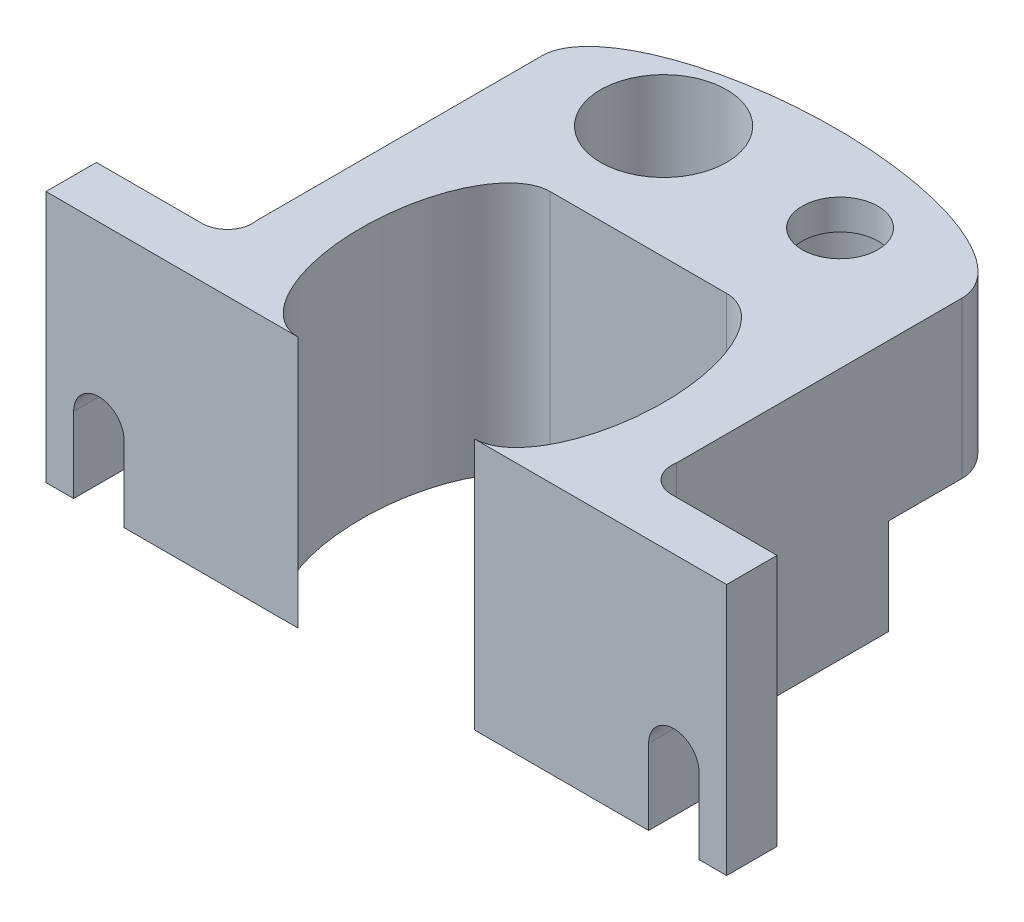
ISO-10303-21;
HEADER;
FILE_DESCRIPTION(('STEP AP214'),'2;1');
FILE_NAME('part.step','',(''),(''),'','','');
FILE_SCHEMA(('AUTOMOTIVE_DESIGN { 1 0 10303 214 1 1 1 1 }'));
ENDSEC;
DATA;
#1=APPLICATION_CONTEXT('core data for automotive mechanical design processes');
#2=APPLICATION_PROTOCOL_DEFINITION('international standard','automotive_design',2000,#1);
#3=PRODUCT_CONTEXT('',#1,'mechanical');
#4=PRODUCT('Part','Part','',(#3));
#5=PRODUCT_RELATED_PRODUCT_CATEGORY('part','',(#4));
#6=PRODUCT_DEFINITION_FORMATION('','',#4);
#7=PRODUCT_DEFINITION_CONTEXT('part definition',#1,'design');
#8=PRODUCT_DEFINITION('design','',#6,#7);
#9=PRODUCT_DEFINITION_SHAPE('','',#8);
#10=(LENGTH_UNIT() NAMED_UNIT(*) SI_UNIT(.MILLI.,.METRE.));
#11=(NAMED_UNIT(*) PLANE_ANGLE_UNIT() SI_UNIT($,.RADIAN.));
#12=(NAMED_UNIT(*) SI_UNIT($,.STERADIAN.) SOLID_ANGLE_UNIT());
#13=UNCERTAINTY_MEASURE_WITH_UNIT(LENGTH_MEASURE(1.E-05),#10,'distance_accuracy_value','');
#14=(GEOMETRIC_REPRESENTATION_CONTEXT(3) GLOBAL_UNCERTAINTY_ASSIGNED_CONTEXT((#13)) GLOBAL_UNIT_ASSIGNED_CONTEXT((#10,
#11,#12)) REPRESENTATION_CONTEXT('',''));
#15=CARTESIAN_POINT('',(0.,0.,0.));
#16=DIRECTION('',(0.,0.,1.));
#17=DIRECTION('',(1.,0.,0.));
#18=AXIS2_PLACEMENT_3D('',#15,#16,#17);
#19=CARTESIAN_POINT('',(0.,0.,0.));
#20=DIRECTION('',(0.,1.,0.));
#21=DIRECTION('',(0.,0.,1.));
#22=AXIS2_PLACEMENT_3D('',#19,#20,#21);
#23=PLANE('',#22);
#24=DIRECTION('',(-1.,0.,0.));
#25=VECTOR('',#24,1.);
#26=CARTESIAN_POINT('',(0.,0.,3.));
#27=LINE('',#26,#25);
#28=CARTESIAN_POINT('',(10.4056244535334,0.,3.));
#29=VERTEX_POINT('',#28);
#30=CARTESIAN_POINT('',(9.31124890706684,0.,3.));
#31=VERTEX_POINT('',#30);
#32=EDGE_CURVE('E317',#29,#31,#27,.T.);
#33=ORIENTED_EDGE('',*,*,#32,.F.);
#34=DIRECTION('',(0.,0.,-1.));
#35=VECTOR('',#34,1.);
#36=CARTESIAN_POINT('',(10.4056244535334,0.,13.));
#37=LINE('',#36,#35);
#38=CARTESIAN_POINT('',(10.4056244535334,0.,5.));
#39=VERTEX_POINT('',#38);
#40=EDGE_CURVE('E441',#39,#29,#37,.T.);
#41=ORIENTED_EDGE('',*,*,#40,.F.);
#42=DIRECTION('',(1.,0.,0.));
#43=VECTOR('',#42,1.);
#44=CARTESIAN_POINT('',(0.,0.,5.));
#45=LINE('',#44,#43);
#46=CARTESIAN_POINT('',(3.5,0.,5.));
#47=VERTEX_POINT('',#46);
#48=EDGE_CURVE('E312',#47,#39,#45,.T.);
#49=ORIENTED_EDGE('',*,*,#48,.F.);
#50=CARTESIAN_POINT('',(3.5,0.,0.));
#51=DIRECTION('',(0.,1.,0.));
#52=DIRECTION('',(0.,0.,-1.));
#53=AXIS2_PLACEMENT_3D('',#50,#51,#52);
#54=ELLIPSE('',#53,5.,2.4986948245632);
#55=CARTESIAN_POINT('',(3.5,0.,-5.));
#56=VERTEX_POINT('',#55);
#57=EDGE_CURVE('E307',#47,#56,#54,.T.);
#58=ORIENTED_EDGE('',*,*,#57,.T.);
#59=DIRECTION('',(1.,0.,0.));
#60=VECTOR('',#59,1.);
#61=CARTESIAN_POINT('',(0.,0.,-5.));
#62=LINE('',#61,#60);
#63=CARTESIAN_POINT('',(-3.5,0.,-5.));
#64=VERTEX_POINT('',#63);
#65=EDGE_CURVE('E348',#64,#56,#62,.T.);
#66=ORIENTED_EDGE('',*,*,#65,.F.);
#67=CARTESIAN_POINT('',(-3.5,0.,0.));
#68=DIRECTION('',(0.,1.,0.));
#69=DIRECTION('',(0.,0.,-1.));
#70=AXIS2_PLACEMENT_3D('',#67,#68,#69);
#71=ELLIPSE('',#70,5.,2.49975501213094);
#72=CARTESIAN_POINT('',(-3.5,0.,5.));
#73=VERTEX_POINT('',#72);
#74=EDGE_CURVE('E345',#64,#73,#71,.T.);
#75=ORIENTED_EDGE('',*,*,#74,.T.);
#76=DIRECTION('',(-1.,0.,0.));
#77=VECTOR('',#76,1.);
#78=CARTESIAN_POINT('',(0.,0.,5.));
#79=LINE('',#78,#77);
#80=CARTESIAN_POINT('',(-10.4039310211756,0.,5.));
#81=VERTEX_POINT('',#80);
#82=EDGE_CURVE('E342',#73,#81,#79,.T.);
#83=ORIENTED_EDGE('',*,*,#82,.T.);
#84=DIRECTION('',(0.,0.,-1.));
#85=VECTOR('',#84,1.);
#86=CARTESIAN_POINT('',(-10.4039310211756,0.,0.));
#87=LINE('',#86,#85);
#88=CARTESIAN_POINT('',(-10.4039310211756,0.,3.));
#89=VERTEX_POINT('',#88);
#90=EDGE_CURVE('E44',#81,#89,#87,.T.);
#91=ORIENTED_EDGE('',*,*,#90,.T.);
#92=DIRECTION('',(1.,0.,0.));
#93=VECTOR('',#92,1.);
#94=CARTESIAN_POINT('',(0.,0.,3.));
#95=LINE('',#94,#93);
#96=CARTESIAN_POINT('',(-9.30786204235129,0.,3.));
#97=VERTEX_POINT('',#96);
#98=EDGE_CURVE('E334',#89,#97,#95,.T.);
#99=ORIENTED_EDGE('',*,*,#98,.T.);
#100=CARTESIAN_POINT('',(-9.30786204235129,0.,2.00000000000001));
#101=DIRECTION('',(0.,1.,0.));
#102=DIRECTION('',(0.,0.,1.));
#103=AXIS2_PLACEMENT_3D('',#100,#101,#102);
#104=CIRCLE('',#103,0.999999999999997);
#105=CARTESIAN_POINT('',(-8.32568240430338,0.,1.8120554374182));
#106=VERTEX_POINT('',#105);
#107=EDGE_CURVE('E331',#97,#106,#104,.T.);
#108=ORIENTED_EDGE('',*,*,#107,.T.);
#109=DIRECTION('',(0.,0.,-1.));
#110=VECTOR('',#109,1.);
#111=CARTESIAN_POINT('',(-8.32568240430338,0.,0.));
#112=LINE('',#111,#110);
#113=CARTESIAN_POINT('',(-8.32568240430338,0.,-6.6));
#114=VERTEX_POINT('',#113);
#115=EDGE_CURVE('E328',#106,#114,#112,.T.);
#116=ORIENTED_EDGE('',*,*,#115,.T.);
#117=DIRECTION('',(1.,0.,0.));
#118=VECTOR('',#117,1.);
#119=CARTESIAN_POINT('',(0.,0.,-6.6));
#120=LINE('',#119,#118);
#121=CARTESIAN_POINT('',(8.32909126483986,0.,-6.6));
#122=VERTEX_POINT('',#121);
#123=EDGE_CURVE('E325',#114,#122,#120,.T.);
#124=ORIENTED_EDGE('',*,*,#123,.T.);
#125=DIRECTION('',(0.,0.,-1.));
#126=VECTOR('',#125,1.);
#127=CARTESIAN_POINT('',(8.32909126483986,0.,0.));
#128=LINE('',#127,#126);
#129=CARTESIAN_POINT('',(8.32909126483986,0.,1.81194052585648));
#130=VERTEX_POINT('',#129);
#131=EDGE_CURVE('E323',#130,#122,#128,.T.);
#132=ORIENTED_EDGE('',*,*,#131,.F.);
#133=CARTESIAN_POINT('',(9.31124890706684,0.,2.));
#134=DIRECTION('',(0.,1.,0.));
#135=DIRECTION('',(0.,0.,1.));
#136=AXIS2_PLACEMENT_3D('',#133,#134,#135);
#137=CIRCLE('',#136,0.999999999999998);
#138=EDGE_CURVE('E321',#31,#130,#137,.F.);
#139=ORIENTED_EDGE('',*,*,#138,.F.);
#140=EDGE_LOOP('',(#33,#41,#49,#58,#66,#75,#83,#91,#99,#108,#116,#124,#132,#139));
#141=FACE_BOUND('',#140,.T.);
#142=ADVANCED_FACE('F35',(#141),#23,.F.);
#143=CARTESIAN_POINT('',(12.4056244535334,0.,5.));
#144=VERTEX_POINT('',#143);
#145=CARTESIAN_POINT('',(13.5,0.,5.));
#146=VERTEX_POINT('',#145);
#147=EDGE_CURVE('E310',#144,#146,#45,.T.);
#148=ORIENTED_EDGE('',*,*,#147,.F.);
#149=DIRECTION('',(0.,0.,-1.));
#150=VECTOR('',#149,1.);
#151=CARTESIAN_POINT('',(12.4056244535334,0.,13.));
#152=LINE('',#151,#150);
#153=CARTESIAN_POINT('',(12.4056244535334,0.,3.));
#154=VERTEX_POINT('',#153);
#155=EDGE_CURVE('E433',#144,#154,#152,.T.);
#156=ORIENTED_EDGE('',*,*,#155,.T.);
#157=CARTESIAN_POINT('',(13.5,0.,3.));
#158=VERTEX_POINT('',#157);
#159=EDGE_CURVE('E318',#158,#154,#27,.T.);
#160=ORIENTED_EDGE('',*,*,#159,.F.);
#161=DIRECTION('',(0.,0.,-1.));
#162=VECTOR('',#161,1.);
#163=CARTESIAN_POINT('',(13.5,0.,0.));
#164=LINE('',#163,#162);
#165=EDGE_CURVE('E315',#146,#158,#164,.T.);
#166=ORIENTED_EDGE('',*,*,#165,.F.);
#167=EDGE_LOOP('',(#148,#156,#160,#166));
#168=FACE_BOUND('',#167,.T.);
#169=ADVANCED_FACE('F286',(#168),#23,.F.);
#170=CARTESIAN_POINT('',(3.5,10.,0.));
#171=DIRECTION('',(0.,1.,0.));
#172=DIRECTION('',(0.,0.,-1.));
#173=AXIS2_PLACEMENT_3D('',#170,#171,#172);
#174=ELLIPSE('',#173,5.,2.4986948245632);
#175=DIRECTION('',(0.,-1.,0.));
#176=VECTOR('',#175,1.);
#177=SURFACE_OF_LINEAR_EXTRUSION('',#174,#176);
#178=ORIENTED_EDGE('',*,*,#57,.F.);
#179=DIRECTION('',(0.,-1.,0.));
#180=VECTOR('',#179,1.);
#181=CARTESIAN_POINT('',(3.5,10.,5.));
#182=LINE('',#181,#180);
#183=CARTESIAN_POINT('',(3.5,10.,5.));
#184=VERTEX_POINT('',#183);
#185=EDGE_CURVE('E381',#184,#47,#182,.T.);
#186=ORIENTED_EDGE('',*,*,#185,.F.);
#187=CARTESIAN_POINT('',(3.5,10.,-5.));
#188=VERTEX_POINT('',#187);
#189=EDGE_CURVE('E351',#184,#188,#174,.T.);
#190=ORIENTED_EDGE('',*,*,#189,.T.);
#191=DIRECTION('',(0.,-1.,0.));
#192=VECTOR('',#191,1.);
#193=CARTESIAN_POINT('',(3.5,10.,-5.));
#194=LINE('',#193,#192);
#195=EDGE_CURVE('E306',#188,#56,#194,.T.);
#196=ORIENTED_EDGE('',*,*,#195,.T.);
#197=EDGE_LOOP('',(#178,#186,#190,#196));
#198=FACE_BOUND('',#197,.T.);
#199=ADVANCED_FACE('F37',(#198),#177,.T.);
#200=CARTESIAN_POINT('',(0.,10.,5.));
#201=DIRECTION('',(0.,0.,-1.));
#202=DIRECTION('',(-1.,0.,0.));
#203=AXIS2_PLACEMENT_3D('',#200,#201,#202);
#204=PLANE('',#203);
#205=ORIENTED_EDGE('',*,*,#48,.T.);
#206=DIRECTION('',(0.,1.,0.));
#207=VECTOR('',#206,1.);
#208=CARTESIAN_POINT('',(10.4056244535334,10.,5.));
#209=LINE('',#208,#207);
#210=CARTESIAN_POINT('',(10.4056244535334,3.,5.));
#211=VERTEX_POINT('',#210);
#212=EDGE_CURVE('E447',#39,#211,#209,.T.);
#213=ORIENTED_EDGE('',*,*,#212,.T.);
#214=CARTESIAN_POINT('',(11.4056244535334,3.,5.));
#215=DIRECTION('',(0.,0.,-1.));
#216=DIRECTION('',(-1.,0.,0.));
#217=AXIS2_PLACEMENT_3D('',#214,#215,#216);
#218=CIRCLE('',#217,1.);
#219=CARTESIAN_POINT('',(12.4056244535334,3.,5.));
#220=VERTEX_POINT('',#219);
#221=EDGE_CURVE('E450',#211,#220,#218,.T.);
#222=ORIENTED_EDGE('',*,*,#221,.T.);
#223=DIRECTION('',(0.,-1.,0.));
#224=VECTOR('',#223,1.);
#225=CARTESIAN_POINT('',(12.4056244535334,10.,5.));
#226=LINE('',#225,#224);
#227=EDGE_CURVE('E440',#220,#144,#226,.T.);
#228=ORIENTED_EDGE('',*,*,#227,.T.);
#229=ORIENTED_EDGE('',*,*,#147,.T.);
#230=DIRECTION('',(0.,-1.,0.));
#231=VECTOR('',#230,1.);
#232=CARTESIAN_POINT('',(13.5,10.,5.));
#233=LINE('',#232,#231);
#234=CARTESIAN_POINT('',(13.5,10.,5.));
#235=VERTEX_POINT('',#234);
#236=EDGE_CURVE('E378',#235,#146,#233,.T.);
#237=ORIENTED_EDGE('',*,*,#236,.F.);
#238=DIRECTION('',(1.,0.,0.));
#239=VECTOR('',#238,1.);
#240=CARTESIAN_POINT('',(0.,10.,5.));
#241=LINE('',#240,#239);
#242=EDGE_CURVE('E469',#184,#235,#241,.T.);
#243=ORIENTED_EDGE('',*,*,#242,.F.);
#244=ORIENTED_EDGE('',*,*,#185,.T.);
#245=EDGE_LOOP('',(#205,#213,#222,#228,#229,#237,#243,#244));
#246=FACE_BOUND('',#245,.T.);
#247=ADVANCED_FACE('F503',(#246),#204,.F.);
#248=CARTESIAN_POINT('',(13.5,10.,0.));
#249=DIRECTION('',(-1.,0.,0.));
#250=DIRECTION('',(0.,0.,1.));
#251=AXIS2_PLACEMENT_3D('',#248,#249,#250);
#252=PLANE('',#251);
#253=ORIENTED_EDGE('',*,*,#165,.T.);
#254=DIRECTION('',(0.,-1.,0.));
#255=VECTOR('',#254,1.);
#256=CARTESIAN_POINT('',(13.5,10.,3.));
#257=LINE('',#256,#255);
#258=CARTESIAN_POINT('',(13.5,10.,3.));
#259=VERTEX_POINT('',#258);
#260=EDGE_CURVE('E375',#259,#158,#257,.T.);
#261=ORIENTED_EDGE('',*,*,#260,.F.);
#262=DIRECTION('',(0.,0.,-1.));
#263=VECTOR('',#262,1.);
#264=CARTESIAN_POINT('',(13.5,10.,0.));
#265=LINE('',#264,#263);
#266=EDGE_CURVE('E471',#235,#259,#265,.T.);
#267=ORIENTED_EDGE('',*,*,#266,.F.);
#268=ORIENTED_EDGE('',*,*,#236,.T.);
#269=EDGE_LOOP('',(#253,#261,#267,#268));
#270=FACE_BOUND('',#269,.T.);
#271=ADVANCED_FACE('F509',(#270),#252,.F.);
#272=CARTESIAN_POINT('',(0.,10.,3.));
#273=DIRECTION('',(0.,0.,1.));
#274=DIRECTION('',(1.,0.,0.));
#275=AXIS2_PLACEMENT_3D('',#272,#273,#274);
#276=PLANE('',#275);
#277=CARTESIAN_POINT('',(11.4056244535334,3.,3.));
#278=DIRECTION('',(0.,0.,-1.));
#279=DIRECTION('',(-1.,0.,0.));
#280=AXIS2_PLACEMENT_3D('',#277,#278,#279);
#281=CIRCLE('',#280,1.);
#282=CARTESIAN_POINT('',(10.4056244535334,3.,3.));
#283=VERTEX_POINT('',#282);
#284=CARTESIAN_POINT('',(12.4056244535334,3.,3.));
#285=VERTEX_POINT('',#284);
#286=EDGE_CURVE('E427',#283,#285,#281,.T.);
#287=ORIENTED_EDGE('',*,*,#286,.F.);
#288=DIRECTION('',(0.,1.,0.));
#289=VECTOR('',#288,1.);
#290=CARTESIAN_POINT('',(10.4056244535334,3.,3.));
#291=LINE('',#290,#289);
#292=EDGE_CURVE('E425',#29,#283,#291,.T.);
#293=ORIENTED_EDGE('',*,*,#292,.F.);
#294=ORIENTED_EDGE('',*,*,#32,.T.);
#295=DIRECTION('',(0.,-1.,0.));
#296=VECTOR('',#295,1.);
#297=CARTESIAN_POINT('',(9.31124890706684,10.,3.));
#298=LINE('',#297,#296);
#299=CARTESIAN_POINT('',(9.31124890706684,10.,3.));
#300=VERTEX_POINT('',#299);
#301=EDGE_CURVE('E372',#300,#31,#298,.T.);
#302=ORIENTED_EDGE('',*,*,#301,.F.);
#303=DIRECTION('',(-1.,0.,0.));
#304=VECTOR('',#303,1.);
#305=CARTESIAN_POINT('',(0.,10.,3.));
#306=LINE('',#305,#304);
#307=EDGE_CURVE('E422',#259,#300,#306,.T.);
#308=ORIENTED_EDGE('',*,*,#307,.F.);
#309=ORIENTED_EDGE('',*,*,#260,.T.);
#310=ORIENTED_EDGE('',*,*,#159,.T.);
#311=DIRECTION('',(0.,-1.,0.));
#312=VECTOR('',#311,1.);
#313=CARTESIAN_POINT('',(12.4056244535334,3.,3.));
#314=LINE('',#313,#312);
#315=EDGE_CURVE('E430',#285,#154,#314,.T.);
#316=ORIENTED_EDGE('',*,*,#315,.F.);
#317=EDGE_LOOP('',(#287,#293,#294,#302,#308,#309,#310,#316));
#318=FACE_BOUND('',#317,.T.);
#319=ADVANCED_FACE('F421',(#318),#276,.F.);
#320=CARTESIAN_POINT('',(9.31124890706684,10.,2.));
#321=DIRECTION('',(0.,-1.,0.));
#322=DIRECTION('',(0.,0.,-1.));
#323=AXIS2_PLACEMENT_3D('',#320,#321,#322);
#324=CYLINDRICAL_SURFACE('',#323,0.999999999999998);
#325=ORIENTED_EDGE('',*,*,#138,.T.);
#326=DIRECTION('',(0.,-1.,0.));
#327=VECTOR('',#326,1.);
#328=CARTESIAN_POINT('',(8.32909126483986,10.,1.81194052585648));
#329=LINE('',#328,#327);
#330=CARTESIAN_POINT('',(8.32909126483986,10.,1.81194052585648));
#331=VERTEX_POINT('',#330);
#332=EDGE_CURVE('E369',#331,#130,#329,.T.);
#333=ORIENTED_EDGE('',*,*,#332,.F.);
#334=CARTESIAN_POINT('',(9.31124890706684,10.,2.));
#335=DIRECTION('',(0.,1.,0.));
#336=DIRECTION('',(0.,0.,1.));
#337=AXIS2_PLACEMENT_3D('',#334,#335,#336);
#338=CIRCLE('',#337,0.999999999999998);
#339=EDGE_CURVE('E417',#300,#331,#338,.F.);
#340=ORIENTED_EDGE('',*,*,#339,.F.);
#341=ORIENTED_EDGE('',*,*,#301,.T.);
#342=EDGE_LOOP('',(#325,#333,#340,#341));
#343=FACE_BOUND('',#342,.T.);
#344=ADVANCED_FACE('F414',(#343),#324,.F.);
#345=CARTESIAN_POINT('',(8.32909126483986,10.,0.));
#346=DIRECTION('',(-1.,0.,0.));
#347=DIRECTION('',(0.,0.,1.));
#348=AXIS2_PLACEMENT_3D('',#345,#346,#347);
#349=PLANE('',#348);
#350=DIRECTION('',(0.,-1.,0.));
#351=VECTOR('',#350,1.);
#352=CARTESIAN_POINT('',(8.32909126483986,10.,-6.6));
#353=LINE('',#352,#351);
#354=CARTESIAN_POINT('',(8.32909126483986,3.8,-6.6));
#355=VERTEX_POINT('',#354);
#356=EDGE_CURVE('E212',#355,#122,#353,.T.);
#357=ORIENTED_EDGE('',*,*,#356,.F.);
#358=DIRECTION('',(0.,0.,1.));
#359=VECTOR('',#358,1.);
#360=CARTESIAN_POINT('',(8.32909126483986,3.8,0.));
#361=LINE('',#360,#359);
#362=CARTESIAN_POINT('',(8.32909126483986,3.8,-9.4986379308905));
#363=VERTEX_POINT('',#362);
#364=EDGE_CURVE('E209',#363,#355,#361,.T.);
#365=ORIENTED_EDGE('',*,*,#364,.F.);
#366=DIRECTION('',(0.,1.,0.));
#367=VECTOR('',#366,1.);
#368=CARTESIAN_POINT('',(8.32909126483986,8.8,-9.4986379308905));
#369=LINE('',#368,#367);
#370=CARTESIAN_POINT('',(8.32909126483986,10.,-9.4986379308905));
#371=VERTEX_POINT('',#370);
#372=EDGE_CURVE('E195',#363,#371,#369,.T.);
#373=ORIENTED_EDGE('',*,*,#372,.T.);
#374=DIRECTION('',(0.,0.,-1.));
#375=VECTOR('',#374,1.);
#376=CARTESIAN_POINT('',(8.32909126483986,10.,0.));
#377=LINE('',#376,#375);
#378=EDGE_CURVE('E475',#331,#371,#377,.T.);
#379=ORIENTED_EDGE('',*,*,#378,.F.);
#380=ORIENTED_EDGE('',*,*,#332,.T.);
#381=ORIENTED_EDGE('',*,*,#131,.T.);
#382=EDGE_LOOP('',(#357,#365,#373,#379,#380,#381));
#383=FACE_BOUND('',#382,.T.);
#384=ADVANCED_FACE('F210',(#383),#349,.F.);
#385=CARTESIAN_POINT('',(0.,10.,-6.6));
#386=DIRECTION('',(0.,0.,-1.));
#387=DIRECTION('',(-1.,0.,0.));
#388=AXIS2_PLACEMENT_3D('',#385,#386,#387);
#389=PLANE('',#388);
#390=DIRECTION('',(-1.,0.,0.));
#391=VECTOR('',#390,1.);
#392=CARTESIAN_POINT('',(0.,3.8,-6.6));
#393=LINE('',#392,#391);
#394=CARTESIAN_POINT('',(-8.32568240430338,3.8,-6.6));
#395=VERTEX_POINT('',#394);
#396=EDGE_CURVE('E51',#355,#395,#393,.T.);
#397=ORIENTED_EDGE('',*,*,#396,.F.);
#398=ORIENTED_EDGE('',*,*,#356,.T.);
#399=ORIENTED_EDGE('',*,*,#123,.F.);
#400=DIRECTION('',(0.,-1.,0.));
#401=VECTOR('',#400,1.);
#402=CARTESIAN_POINT('',(-8.32568240430338,10.,-6.6));
#403=LINE('',#402,#401);
#404=EDGE_CURVE('E56',#395,#114,#403,.T.);
#405=ORIENTED_EDGE('',*,*,#404,.F.);
#406=EDGE_LOOP('',(#397,#398,#399,#405));
#407=FACE_BOUND('',#406,.T.);
#408=ADVANCED_FACE('F409',(#407),#389,.T.);
#409=CARTESIAN_POINT('',(-8.32568240430338,10.,0.));
#410=DIRECTION('',(-1.,0.,0.));
#411=DIRECTION('',(0.,0.,1.));
#412=AXIS2_PLACEMENT_3D('',#409,#410,#411);
#413=PLANE('',#412);
#414=DIRECTION('',(0.,0.,-1.));
#415=VECTOR('',#414,1.);
#416=CARTESIAN_POINT('',(-8.32568240430338,3.8,0.));
#417=LINE('',#416,#415);
#418=CARTESIAN_POINT('',(-8.32568240430338,3.8,-9.59407867159623));
#419=VERTEX_POINT('',#418);
#420=EDGE_CURVE('E219',#395,#419,#417,.T.);
#421=ORIENTED_EDGE('',*,*,#420,.F.);
#422=ORIENTED_EDGE('',*,*,#404,.T.);
#423=ORIENTED_EDGE('',*,*,#115,.F.);
#424=DIRECTION('',(0.,-1.,0.));
#425=VECTOR('',#424,1.);
#426=CARTESIAN_POINT('',(-8.32568240430338,10.,1.8120554374182));
#427=LINE('',#426,#425);
#428=CARTESIAN_POINT('',(-8.32568240430338,10.,1.8120554374182));
#429=VERTEX_POINT('',#428);
#430=EDGE_CURVE('E365',#429,#106,#427,.T.);
#431=ORIENTED_EDGE('',*,*,#430,.F.);
#432=DIRECTION('',(0.,0.,-1.));
#433=VECTOR('',#432,1.);
#434=CARTESIAN_POINT('',(-8.32568240430338,10.,0.));
#435=LINE('',#434,#433);
#436=CARTESIAN_POINT('',(-8.32568240430338,10.,-9.59407867159623));
#437=VERTEX_POINT('',#436);
#438=EDGE_CURVE('E477',#429,#437,#435,.T.);
#439=ORIENTED_EDGE('',*,*,#438,.T.);
#440=DIRECTION('',(0.,1.,0.));
#441=VECTOR('',#440,1.);
#442=CARTESIAN_POINT('',(-8.32568240430338,8.8,-9.59407867159623));
#443=LINE('',#442,#441);
#444=EDGE_CURVE('E205',#419,#437,#443,.T.);
#445=ORIENTED_EDGE('',*,*,#444,.F.);
#446=EDGE_LOOP('',(#421,#422,#423,#431,#439,#445));
#447=FACE_BOUND('',#446,.T.);
#448=ADVANCED_FACE('F407',(#447),#413,.T.);
#449=CARTESIAN_POINT('',(-9.30786204235129,10.,2.00000000000001));
#450=DIRECTION('',(0.,-1.,0.));
#451=DIRECTION('',(0.,0.,-1.));
#452=AXIS2_PLACEMENT_3D('',#449,#450,#451);
#453=CYLINDRICAL_SURFACE('',#452,0.999999999999997);
#454=ORIENTED_EDGE('',*,*,#107,.F.);
#455=DIRECTION('',(0.,-1.,0.));
#456=VECTOR('',#455,1.);
#457=CARTESIAN_POINT('',(-9.30786204235129,10.,3.));
#458=LINE('',#457,#456);
#459=CARTESIAN_POINT('',(-9.30786204235129,10.,3.));
#460=VERTEX_POINT('',#459);
#461=EDGE_CURVE('E362',#460,#97,#458,.T.);
#462=ORIENTED_EDGE('',*,*,#461,.F.);
#463=CARTESIAN_POINT('',(-9.30786204235129,10.,2.00000000000001));
#464=DIRECTION('',(0.,1.,0.));
#465=DIRECTION('',(0.,0.,1.));
#466=AXIS2_PLACEMENT_3D('',#463,#464,#465);
#467=CIRCLE('',#466,0.999999999999997);
#468=EDGE_CURVE('E479',#460,#429,#467,.T.);
#469=ORIENTED_EDGE('',*,*,#468,.T.);
#470=ORIENTED_EDGE('',*,*,#430,.T.);
#471=EDGE_LOOP('',(#454,#462,#469,#470));
#472=FACE_BOUND('',#471,.T.);
#473=ADVANCED_FACE('F403',(#472),#453,.F.);
#474=CARTESIAN_POINT('',(0.,10.,3.));
#475=DIRECTION('',(0.,0.,-1.));
#476=DIRECTION('',(-1.,0.,0.));
#477=AXIS2_PLACEMENT_3D('',#474,#475,#476);
#478=PLANE('',#477);
#479=DIRECTION('',(0.,-1.,0.));
#480=VECTOR('',#479,1.);
#481=CARTESIAN_POINT('',(-10.4039310211756,3.,3.));
#482=LINE('',#481,#480);
#483=CARTESIAN_POINT('',(-10.4039310211756,3.,3.));
#484=VERTEX_POINT('',#483);
#485=EDGE_CURVE('E395',#484,#89,#482,.T.);
#486=ORIENTED_EDGE('',*,*,#485,.F.);
#487=CARTESIAN_POINT('',(-11.4039310211756,3.,3.));
#488=DIRECTION('',(0.,0.,-1.));
#489=DIRECTION('',(-1.,0.,0.));
#490=AXIS2_PLACEMENT_3D('',#487,#488,#489);
#491=CIRCLE('',#490,1.);
#492=CARTESIAN_POINT('',(-12.4039310211757,3.,3.));
#493=VERTEX_POINT('',#492);
#494=EDGE_CURVE('E457',#493,#484,#491,.T.);
#495=ORIENTED_EDGE('',*,*,#494,.F.);
#496=DIRECTION('',(0.,1.,0.));
#497=VECTOR('',#496,1.);
#498=CARTESIAN_POINT('',(-12.4039310211757,3.,3.));
#499=LINE('',#498,#497);
#500=CARTESIAN_POINT('',(-12.4039310211757,0.,3.));
#501=VERTEX_POINT('',#500);
#502=EDGE_CURVE('E454',#501,#493,#499,.T.);
#503=ORIENTED_EDGE('',*,*,#502,.F.);
#504=CARTESIAN_POINT('',(-13.5,0.,3.));
#505=VERTEX_POINT('',#504);
#506=EDGE_CURVE('E335',#505,#501,#95,.T.);
#507=ORIENTED_EDGE('',*,*,#506,.F.);
#508=DIRECTION('',(0.,-1.,0.));
#509=VECTOR('',#508,1.);
#510=CARTESIAN_POINT('',(-13.5,10.,3.));
#511=LINE('',#510,#509);
#512=CARTESIAN_POINT('',(-13.5,10.,3.));
#513=VERTEX_POINT('',#512);
#514=EDGE_CURVE('E360',#513,#505,#511,.T.);
#515=ORIENTED_EDGE('',*,*,#514,.F.);
#516=DIRECTION('',(1.,0.,0.));
#517=VECTOR('',#516,1.);
#518=CARTESIAN_POINT('',(0.,10.,3.));
#519=LINE('',#518,#517);
#520=EDGE_CURVE('E399',#513,#460,#519,.T.);
#521=ORIENTED_EDGE('',*,*,#520,.T.);
#522=ORIENTED_EDGE('',*,*,#461,.T.);
#523=ORIENTED_EDGE('',*,*,#98,.F.);
#524=EDGE_LOOP('',(#486,#495,#503,#507,#515,#521,#522,#523));
#525=FACE_BOUND('',#524,.T.);
#526=ADVANCED_FACE('F393',(#525),#478,.T.);
#527=CARTESIAN_POINT('',(-13.5,10.,0.));
#528=DIRECTION('',(-1.,0.,0.));
#529=DIRECTION('',(0.,0.,1.));
#530=AXIS2_PLACEMENT_3D('',#527,#528,#529);
#531=PLANE('',#530);
#532=DIRECTION('',(0.,0.,-1.));
#533=VECTOR('',#532,1.);
#534=CARTESIAN_POINT('',(-13.5,0.,0.));
#535=LINE('',#534,#533);
#536=CARTESIAN_POINT('',(-13.5,0.,5.));
#537=VERTEX_POINT('',#536);
#538=EDGE_CURVE('E338',#537,#505,#535,.T.);
#539=ORIENTED_EDGE('',*,*,#538,.F.);
#540=DIRECTION('',(0.,-1.,0.));
#541=VECTOR('',#540,1.);
#542=CARTESIAN_POINT('',(-13.5,10.,5.));
#543=LINE('',#542,#541);
#544=CARTESIAN_POINT('',(-13.5,10.,5.));
#545=VERTEX_POINT('',#544);
#546=EDGE_CURVE('E357',#545,#537,#543,.T.);
#547=ORIENTED_EDGE('',*,*,#546,.F.);
#548=DIRECTION('',(0.,0.,-1.));
#549=VECTOR('',#548,1.);
#550=CARTESIAN_POINT('',(-13.5,10.,0.));
#551=LINE('',#550,#549);
#552=EDGE_CURVE('E481',#545,#513,#551,.T.);
#553=ORIENTED_EDGE('',*,*,#552,.T.);
#554=ORIENTED_EDGE('',*,*,#514,.T.);
#555=EDGE_LOOP('',(#539,#547,#553,#554));
#556=FACE_BOUND('',#555,.T.);
#557=ADVANCED_FACE('F563',(#556),#531,.T.);
#558=CARTESIAN_POINT('',(0.,10.,5.));
#559=DIRECTION('',(0.,0.,1.));
#560=DIRECTION('',(1.,0.,0.));
#561=AXIS2_PLACEMENT_3D('',#558,#559,#560);
#562=PLANE('',#561);
#563=DIRECTION('',(0.,1.,0.));
#564=VECTOR('',#563,1.);
#565=CARTESIAN_POINT('',(-10.4039310211756,9.99999999999999,5.));
#566=LINE('',#565,#564);
#567=CARTESIAN_POINT('',(-10.4039310211756,3.,5.));
#568=VERTEX_POINT('',#567);
#569=EDGE_CURVE('E311',#81,#568,#566,.T.);
#570=ORIENTED_EDGE('',*,*,#569,.F.);
#571=ORIENTED_EDGE('',*,*,#82,.F.);
#572=DIRECTION('',(0.,-1.,0.));
#573=VECTOR('',#572,1.);
#574=CARTESIAN_POINT('',(-3.5,10.,5.));
#575=LINE('',#574,#573);
#576=CARTESIAN_POINT('',(-3.5,10.,5.));
#577=VERTEX_POINT('',#576);
#578=EDGE_CURVE('E355',#577,#73,#575,.T.);
#579=ORIENTED_EDGE('',*,*,#578,.F.);
#580=DIRECTION('',(-1.,0.,0.));
#581=VECTOR('',#580,1.);
#582=CARTESIAN_POINT('',(0.,10.,5.));
#583=LINE('',#582,#581);
#584=EDGE_CURVE('E303',#577,#545,#583,.T.);
#585=ORIENTED_EDGE('',*,*,#584,.T.);
#586=ORIENTED_EDGE('',*,*,#546,.T.);
#587=CARTESIAN_POINT('',(-12.4039310211757,0.,5.));
#588=VERTEX_POINT('',#587);
#589=EDGE_CURVE('E341',#588,#537,#79,.T.);
#590=ORIENTED_EDGE('',*,*,#589,.F.);
#591=DIRECTION('',(0.,-1.,0.));
#592=VECTOR('',#591,1.);
#593=CARTESIAN_POINT('',(-12.4039310211756,10.,5.));
#594=LINE('',#593,#592);
#595=CARTESIAN_POINT('',(-12.4039310211756,3.,5.));
#596=VERTEX_POINT('',#595);
#597=EDGE_CURVE('E463',#596,#588,#594,.T.);
#598=ORIENTED_EDGE('',*,*,#597,.F.);
#599=CARTESIAN_POINT('',(-11.4039310211756,3.,5.));
#600=DIRECTION('',(0.,0.,1.));
#601=DIRECTION('',(1.,0.,0.));
#602=AXIS2_PLACEMENT_3D('',#599,#600,#601);
#603=CIRCLE('',#602,1.);
#604=EDGE_CURVE('E11',#568,#596,#603,.T.);
#605=ORIENTED_EDGE('',*,*,#604,.F.);
#606=EDGE_LOOP('',(#570,#571,#579,#585,#586,#590,#598,#605));
#607=FACE_BOUND('',#606,.T.);
#608=ADVANCED_FACE('F294',(#607),#562,.T.);
#609=CARTESIAN_POINT('',(-3.5,10.,0.));
#610=DIRECTION('',(0.,1.,0.));
#611=DIRECTION('',(0.,0.,-1.));
#612=AXIS2_PLACEMENT_3D('',#609,#610,#611);
#613=ELLIPSE('',#612,5.,2.49975501213094);
#614=DIRECTION('',(0.,-1.,0.));
#615=VECTOR('',#614,1.);
#616=SURFACE_OF_LINEAR_EXTRUSION('',#613,#615);
#617=ORIENTED_EDGE('',*,*,#74,.F.);
#618=DIRECTION('',(0.,-1.,0.));
#619=VECTOR('',#618,1.);
#620=CARTESIAN_POINT('',(-3.5,10.,-5.));
#621=LINE('',#620,#619);
#622=CARTESIAN_POINT('',(-3.5,10.,-5.));
#623=VERTEX_POINT('',#622);
#624=EDGE_CURVE('E353',#623,#64,#621,.T.);
#625=ORIENTED_EDGE('',*,*,#624,.F.);
#626=EDGE_CURVE('E297',#623,#577,#613,.T.);
#627=ORIENTED_EDGE('',*,*,#626,.T.);
#628=ORIENTED_EDGE('',*,*,#578,.T.);
#629=EDGE_LOOP('',(#617,#625,#627,#628));
#630=FACE_BOUND('',#629,.T.);
#631=ADVANCED_FACE('F289',(#630),#616,.T.);
#632=CARTESIAN_POINT('',(0.,10.,-5.));
#633=DIRECTION('',(0.,0.,-1.));
#634=DIRECTION('',(-1.,0.,0.));
#635=AXIS2_PLACEMENT_3D('',#632,#633,#634);
#636=PLANE('',#635);
#637=ORIENTED_EDGE('',*,*,#65,.T.);
#638=ORIENTED_EDGE('',*,*,#195,.F.);
#639=DIRECTION('',(1.,0.,0.));
#640=VECTOR('',#639,1.);
#641=CARTESIAN_POINT('',(0.,10.,-5.));
#642=LINE('',#641,#640);
#643=EDGE_CURVE('E302',#623,#188,#642,.T.);
#644=ORIENTED_EDGE('',*,*,#643,.F.);
#645=ORIENTED_EDGE('',*,*,#624,.T.);
#646=EDGE_LOOP('',(#637,#638,#644,#645));
#647=FACE_BOUND('',#646,.T.);
#648=ADVANCED_FACE('F281',(#647),#636,.F.);
#649=CARTESIAN_POINT('',(0.,10.,0.));
#650=DIRECTION('',(0.,1.,0.));
#651=DIRECTION('',(0.,0.,1.));
#652=AXIS2_PLACEMENT_3D('',#649,#650,#651);
#653=PLANE('',#652);
#654=ORIENTED_EDGE('',*,*,#189,.F.);
#655=ORIENTED_EDGE('',*,*,#242,.T.);
#656=ORIENTED_EDGE('',*,*,#266,.T.);
#657=ORIENTED_EDGE('',*,*,#307,.T.);
#658=ORIENTED_EDGE('',*,*,#339,.T.);
#659=ORIENTED_EDGE('',*,*,#378,.T.);
#660=CARTESIAN_POINT('',(0.,10.,-9.4986379308905));
#661=DIRECTION('',(0.,1.,0.));
#662=DIRECTION('',(1.,0.,0.));
#663=AXIS2_PLACEMENT_3D('',#660,#661,#662);
#664=ELLIPSE('',#663,8.32909126483986,3.33624117163108);
#665=EDGE_CURVE('E202',#371,#437,#664,.T.);
#666=ORIENTED_EDGE('',*,*,#665,.T.);
#667=ORIENTED_EDGE('',*,*,#438,.F.);
#668=ORIENTED_EDGE('',*,*,#468,.F.);
#669=ORIENTED_EDGE('',*,*,#520,.F.);
#670=ORIENTED_EDGE('',*,*,#552,.F.);
#671=ORIENTED_EDGE('',*,*,#584,.F.);
#672=ORIENTED_EDGE('',*,*,#626,.F.);
#673=ORIENTED_EDGE('',*,*,#643,.T.);
#674=EDGE_LOOP('',(#654,#655,#656,#657,#658,#659,#666,#667,#668,#669,#670,#671,#672,#673));
#675=FACE_BOUND('',#674,.T.);
#676=CARTESIAN_POINT('',(-3.5,10.,-9.4986379308905));
#677=DIRECTION('',(0.,1.,0.));
#678=DIRECTION('',(0.,0.,1.));
#679=AXIS2_PLACEMENT_3D('',#676,#677,#678);
#680=CIRCLE('',#679,2.5);
#681=CARTESIAN_POINT('',(-3.5,10.,-6.9986379308905));
#682=VERTEX_POINT('',#681);
#683=EDGE_CURVE('E231',#682,#682,#680,.T.);
#684=ORIENTED_EDGE('',*,*,#683,.F.);
#685=EDGE_LOOP('',(#684));
#686=FACE_BOUND('',#685,.T.);
#687=CARTESIAN_POINT('',(3.5,10.,-9.4986379308905));
#688=DIRECTION('',(0.,1.,0.));
#689=DIRECTION('',(0.,0.,1.));
#690=AXIS2_PLACEMENT_3D('',#687,#688,#689);
#691=CIRCLE('',#690,1.5);
#692=CARTESIAN_POINT('',(3.5,10.,-7.9986379308905));
#693=VERTEX_POINT('',#692);
#694=EDGE_CURVE('E510',#693,#693,#691,.T.);
#695=ORIENTED_EDGE('',*,*,#694,.F.);
#696=EDGE_LOOP('',(#695));
#697=FACE_BOUND('',#696,.T.);
#698=ADVANCED_FACE('F278',(#675,#686,#697),#653,.T.);
#699=ORIENTED_EDGE('',*,*,#506,.T.);
#700=DIRECTION('',(0.,0.,1.));
#701=VECTOR('',#700,1.);
#702=CARTESIAN_POINT('',(-12.4039310211757,0.,0.));
#703=LINE('',#702,#701);
#704=EDGE_CURVE('E383',#501,#588,#703,.T.);
#705=ORIENTED_EDGE('',*,*,#704,.T.);
#706=ORIENTED_EDGE('',*,*,#589,.T.);
#707=ORIENTED_EDGE('',*,*,#538,.T.);
#708=EDGE_LOOP('',(#699,#705,#706,#707));
#709=FACE_BOUND('',#708,.T.);
#710=ADVANCED_FACE('F276',(#709),#23,.F.);
#711=CARTESIAN_POINT('',(-10.4039310211756,3.,13.));
#712=DIRECTION('',(1.,0.,0.));
#713=DIRECTION('',(0.,1.,0.));
#714=AXIS2_PLACEMENT_3D('',#711,#712,#713);
#715=PLANE('',#714);
#716=ORIENTED_EDGE('',*,*,#569,.T.);
#717=DIRECTION('',(0.,0.,-1.));
#718=VECTOR('',#717,1.);
#719=CARTESIAN_POINT('',(-10.4039310211756,3.,13.));
#720=LINE('',#719,#718);
#721=EDGE_CURVE('E461',#568,#484,#720,.T.);
#722=ORIENTED_EDGE('',*,*,#721,.T.);
#723=ORIENTED_EDGE('',*,*,#485,.T.);
#724=ORIENTED_EDGE('',*,*,#90,.F.);
#725=EDGE_LOOP('',(#716,#722,#723,#724));
#726=FACE_BOUND('',#725,.T.);
#727=ADVANCED_FACE('F269',(#726),#715,.F.);
#728=CARTESIAN_POINT('',(-11.4039310211756,3.,13.));
#729=DIRECTION('',(0.,0.,-1.));
#730=DIRECTION('',(-1.,0.,0.));
#731=AXIS2_PLACEMENT_3D('',#728,#729,#730);
#732=CYLINDRICAL_SURFACE('',#731,1.);
#733=ORIENTED_EDGE('',*,*,#604,.T.);
#734=DIRECTION('',(0.,0.,-1.));
#735=VECTOR('',#734,1.);
#736=CARTESIAN_POINT('',(-12.4039310211756,3.,13.));
#737=LINE('',#736,#735);
#738=EDGE_CURVE('E460',#596,#493,#737,.T.);
#739=ORIENTED_EDGE('',*,*,#738,.T.);
#740=ORIENTED_EDGE('',*,*,#494,.T.);
#741=ORIENTED_EDGE('',*,*,#721,.F.);
#742=EDGE_LOOP('',(#733,#739,#740,#741));
#743=FACE_BOUND('',#742,.T.);
#744=ADVANCED_FACE('F266',(#743),#732,.F.);
#745=CARTESIAN_POINT('',(-12.4039310211756,3.,13.));
#746=DIRECTION('',(-1.,0.,0.));
#747=DIRECTION('',(0.,0.,1.));
#748=AXIS2_PLACEMENT_3D('',#745,#746,#747);
#749=PLANE('',#748);
#750=ORIENTED_EDGE('',*,*,#597,.T.);
#751=ORIENTED_EDGE('',*,*,#704,.F.);
#752=ORIENTED_EDGE('',*,*,#502,.T.);
#753=ORIENTED_EDGE('',*,*,#738,.F.);
#754=EDGE_LOOP('',(#750,#751,#752,#753));
#755=FACE_BOUND('',#754,.T.);
#756=ADVANCED_FACE('F264',(#755),#749,.F.);
#757=CARTESIAN_POINT('',(11.4056244535334,3.,13.));
#758=DIRECTION('',(0.,0.,-1.));
#759=DIRECTION('',(-1.,0.,0.));
#760=AXIS2_PLACEMENT_3D('',#757,#758,#759);
#761=CYLINDRICAL_SURFACE('',#760,1.);
#762=DIRECTION('',(0.,0.,-1.));
#763=VECTOR('',#762,1.);
#764=CARTESIAN_POINT('',(10.4056244535334,3.,13.));
#765=LINE('',#764,#763);
#766=EDGE_CURVE('E438',#211,#283,#765,.T.);
#767=ORIENTED_EDGE('',*,*,#766,.T.);
#768=ORIENTED_EDGE('',*,*,#286,.T.);
#769=DIRECTION('',(0.,0.,-1.));
#770=VECTOR('',#769,1.);
#771=CARTESIAN_POINT('',(12.4056244535334,3.,13.));
#772=LINE('',#771,#770);
#773=EDGE_CURVE('E429',#220,#285,#772,.T.);
#774=ORIENTED_EDGE('',*,*,#773,.F.);
#775=ORIENTED_EDGE('',*,*,#221,.F.);
#776=EDGE_LOOP('',(#767,#768,#774,#775));
#777=FACE_BOUND('',#776,.T.);
#778=ADVANCED_FACE('F257',(#777),#761,.F.);
#779=CARTESIAN_POINT('',(10.4056244535334,3.,13.));
#780=DIRECTION('',(-1.,0.,0.));
#781=DIRECTION('',(0.,0.,1.));
#782=AXIS2_PLACEMENT_3D('',#779,#780,#781);
#783=PLANE('',#782);
#784=ORIENTED_EDGE('',*,*,#40,.T.);
#785=ORIENTED_EDGE('',*,*,#292,.T.);
#786=ORIENTED_EDGE('',*,*,#766,.F.);
#787=ORIENTED_EDGE('',*,*,#212,.F.);
#788=EDGE_LOOP('',(#784,#785,#786,#787));
#789=FACE_BOUND('',#788,.T.);
#790=ADVANCED_FACE('F254',(#789),#783,.F.);
#791=CARTESIAN_POINT('',(12.4056244535334,3.,13.));
#792=DIRECTION('',(1.,0.,0.));
#793=DIRECTION('',(0.,0.,-1.));
#794=AXIS2_PLACEMENT_3D('',#791,#792,#793);
#795=PLANE('',#794);
#796=ORIENTED_EDGE('',*,*,#773,.T.);
#797=ORIENTED_EDGE('',*,*,#315,.T.);
#798=ORIENTED_EDGE('',*,*,#155,.F.);
#799=ORIENTED_EDGE('',*,*,#227,.F.);
#800=EDGE_LOOP('',(#796,#797,#798,#799));
#801=FACE_BOUND('',#800,.T.);
#802=ADVANCED_FACE('F249',(#801),#795,.F.);
#803=CARTESIAN_POINT('',(3.5,8.8,-9.4986379308905));
#804=DIRECTION('',(0.,1.,0.));
#805=DIRECTION('',(0.,0.,1.));
#806=AXIS2_PLACEMENT_3D('',#803,#804,#805);
#807=CYLINDRICAL_SURFACE('',#806,1.5);
#808=CARTESIAN_POINT('',(3.5,8.8,-9.4986379308905));
#809=DIRECTION('',(0.,1.,0.));
#810=DIRECTION('',(0.,0.,1.));
#811=AXIS2_PLACEMENT_3D('',#808,#809,#810);
#812=CIRCLE('',#811,1.5);
#813=CARTESIAN_POINT('',(3.5,8.8,-7.9986379308905));
#814=VERTEX_POINT('',#813);
#815=EDGE_CURVE('E206',#814,#814,#812,.T.);
#816=ORIENTED_EDGE('',*,*,#815,.F.);
#817=EDGE_LOOP('',(#816));
#818=FACE_BOUND('',#817,.T.);
#819=ORIENTED_EDGE('',*,*,#694,.T.);
#820=EDGE_LOOP('',(#819));
#821=FACE_BOUND('',#820,.T.);
#822=ADVANCED_FACE('F246',(#818,#821),#807,.F.);
#823=CARTESIAN_POINT('',(-3.5,8.8,-9.4986379308905));
#824=DIRECTION('',(0.,1.,0.));
#825=DIRECTION('',(0.,0.,1.));
#826=AXIS2_PLACEMENT_3D('',#823,#824,#825);
#827=CYLINDRICAL_SURFACE('',#826,2.5);
#828=ORIENTED_EDGE('',*,*,#683,.T.);
#829=EDGE_LOOP('',(#828));
#830=FACE_BOUND('',#829,.T.);
#831=CARTESIAN_POINT('',(-3.5,3.8,-9.4986379308905));
#832=DIRECTION('',(0.,-1.,0.));
#833=DIRECTION('',(0.,0.,-1.));
#834=AXIS2_PLACEMENT_3D('',#831,#832,#833);
#835=CIRCLE('',#834,2.5);
#836=CARTESIAN_POINT('',(-3.5,3.8,-11.9986379308905));
#837=VERTEX_POINT('',#836);
#838=EDGE_CURVE('E228',#837,#837,#835,.F.);
#839=ORIENTED_EDGE('',*,*,#838,.F.);
#840=EDGE_LOOP('',(#839));
#841=FACE_BOUND('',#840,.T.);
#842=ADVANCED_FACE('F244',(#830,#841),#827,.F.);
#843=CARTESIAN_POINT('',(0.,8.8,-9.4986379308905));
#844=DIRECTION('',(0.,1.,0.));
#845=DIRECTION('',(1.,0.,0.));
#846=AXIS2_PLACEMENT_3D('',#843,#844,#845);
#847=ELLIPSE('',#846,8.32909126483986,3.33624117163108);
#848=DIRECTION('',(0.,1.,0.));
#849=VECTOR('',#848,1.);
#850=SURFACE_OF_LINEAR_EXTRUSION('',#847,#849);
#851=ORIENTED_EDGE('',*,*,#665,.F.);
#852=ORIENTED_EDGE('',*,*,#372,.F.);
#853=CARTESIAN_POINT('',(0.,3.8,-9.4986379308905));
#854=DIRECTION('',(0.,-1.,0.));
#855=DIRECTION('',(1.,0.,0.));
#856=AXIS2_PLACEMENT_3D('',#853,#854,#855);
#857=ELLIPSE('',#856,8.32909126483986,3.33624117163108);
#858=EDGE_CURVE('E200',#419,#363,#857,.T.);
#859=ORIENTED_EDGE('',*,*,#858,.F.);
#860=ORIENTED_EDGE('',*,*,#444,.T.);
#861=EDGE_LOOP('',(#851,#852,#859,#860));
#862=FACE_BOUND('',#861,.T.);
#863=ADVANCED_FACE('F197',(#862),#850,.T.);
#864=CARTESIAN_POINT('',(0.,8.8,0.));
#865=DIRECTION('',(0.,1.,0.));
#866=DIRECTION('',(0.,0.,1.));
#867=AXIS2_PLACEMENT_3D('',#864,#865,#866);
#868=PLANE('',#867);
#869=CARTESIAN_POINT('',(3.5,8.8,-9.4986379308905));
#870=DIRECTION('',(0.,-1.,0.));
#871=DIRECTION('',(0.,0.,-1.));
#872=AXIS2_PLACEMENT_3D('',#869,#870,#871);
#873=CIRCLE('',#872,2.5);
#874=CARTESIAN_POINT('',(3.5,8.8,-11.9986379308905));
#875=VERTEX_POINT('',#874);
#876=EDGE_CURVE('E223',#875,#875,#873,.T.);
#877=ORIENTED_EDGE('',*,*,#876,.T.);
#878=EDGE_LOOP('',(#877));
#879=FACE_BOUND('',#878,.T.);
#880=ORIENTED_EDGE('',*,*,#815,.T.);
#881=EDGE_LOOP('',(#880));
#882=FACE_BOUND('',#881,.T.);
#883=ADVANCED_FACE('F243',(#879,#882),#868,.F.);
#884=CARTESIAN_POINT('',(3.5,3.8,-9.4986379308905));
#885=DIRECTION('',(0.,1.,0.));
#886=DIRECTION('',(0.,0.,1.));
#887=AXIS2_PLACEMENT_3D('',#884,#885,#886);
#888=CYLINDRICAL_SURFACE('',#887,2.5);
#889=CARTESIAN_POINT('',(3.5,3.8,-9.4986379308905));
#890=DIRECTION('',(0.,-1.,0.));
#891=DIRECTION('',(0.,0.,-1.));
#892=AXIS2_PLACEMENT_3D('',#889,#890,#891);
#893=CIRCLE('',#892,2.5);
#894=CARTESIAN_POINT('',(3.5,3.8,-11.9986379308905));
#895=VERTEX_POINT('',#894);
#896=EDGE_CURVE('E220',#895,#895,#893,.T.);
#897=ORIENTED_EDGE('',*,*,#896,.T.);
#898=EDGE_LOOP('',(#897));
#899=FACE_BOUND('',#898,.T.);
#900=ORIENTED_EDGE('',*,*,#876,.F.);
#901=EDGE_LOOP('',(#900));
#902=FACE_BOUND('',#901,.T.);
#903=ADVANCED_FACE('F683',(#899,#902),#888,.F.);
#904=CARTESIAN_POINT('',(0.,3.8,0.));
#905=DIRECTION('',(0.,-1.,0.));
#906=DIRECTION('',(0.,0.,-1.));
#907=AXIS2_PLACEMENT_3D('',#904,#905,#906);
#908=PLANE('',#907);
#909=ORIENTED_EDGE('',*,*,#896,.F.);
#910=EDGE_LOOP('',(#909));
#911=FACE_BOUND('',#910,.T.);
#912=ORIENTED_EDGE('',*,*,#858,.T.);
#913=ORIENTED_EDGE('',*,*,#364,.T.);
#914=ORIENTED_EDGE('',*,*,#396,.T.);
#915=ORIENTED_EDGE('',*,*,#420,.T.);
#916=EDGE_LOOP('',(#912,#913,#914,#915));
#917=FACE_BOUND('',#916,.T.);
#918=ORIENTED_EDGE('',*,*,#838,.T.);
#919=EDGE_LOOP('',(#918));
#920=FACE_BOUND('',#919,.T.);
#921=ADVANCED_FACE('F216',(#911,#917,#920),#908,.T.);
#922=CLOSED_SHELL('',(#142,#169,#199,#247,#271,#319,#344,#384,#408,#448,#473,#526,#557,#608,
#631,#648,#698,#710,#727,#744,#756,#778,#790,#802,#822,#842,#863,#883,#903,#921));
#923=MANIFOLD_SOLID_BREP('B2',#922);
#924=ADVANCED_BREP_SHAPE_REPRESENTATION('',(#18,#923),#14);
#925=SHAPE_DEFINITION_REPRESENTATION(#9,#924);
ENDSEC;
END-ISO-10303-21;
